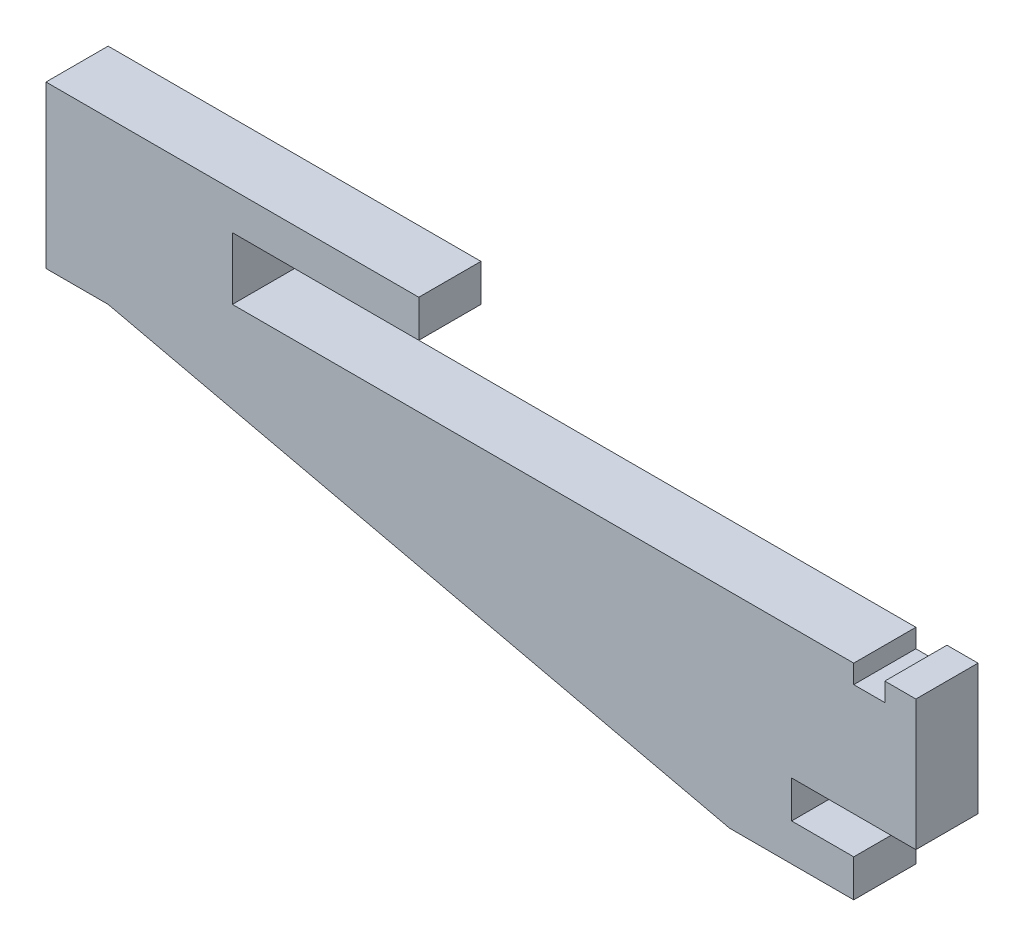
ISO-10303-21;
HEADER;
FILE_DESCRIPTION(('STEP AP214'),'2;1');
FILE_NAME('part.step','',(''),(''),'','','');
FILE_SCHEMA(('AUTOMOTIVE_DESIGN { 1 0 10303 214 1 1 1 1 }'));
ENDSEC;
DATA;
#1=APPLICATION_CONTEXT('core data for automotive mechanical design processes');
#2=APPLICATION_PROTOCOL_DEFINITION('international standard','automotive_design',2000,#1);
#3=PRODUCT_CONTEXT('',#1,'mechanical');
#4=PRODUCT('Part','Part','',(#3));
#5=PRODUCT_RELATED_PRODUCT_CATEGORY('part','',(#4));
#6=PRODUCT_DEFINITION_FORMATION('','',#4);
#7=PRODUCT_DEFINITION_CONTEXT('part definition',#1,'design');
#8=PRODUCT_DEFINITION('design','',#6,#7);
#9=PRODUCT_DEFINITION_SHAPE('','',#8);
#10=(LENGTH_UNIT() NAMED_UNIT(*) SI_UNIT(.MILLI.,.METRE.));
#11=(NAMED_UNIT(*) PLANE_ANGLE_UNIT() SI_UNIT($,.RADIAN.));
#12=(NAMED_UNIT(*) SI_UNIT($,.STERADIAN.) SOLID_ANGLE_UNIT());
#13=UNCERTAINTY_MEASURE_WITH_UNIT(LENGTH_MEASURE(1.E-05),#10,'distance_accuracy_value','');
#14=(GEOMETRIC_REPRESENTATION_CONTEXT(3) GLOBAL_UNCERTAINTY_ASSIGNED_CONTEXT((#13)) GLOBAL_UNIT_ASSIGNED_CONTEXT((#10,
#11,#12)) REPRESENTATION_CONTEXT('',''));
#15=CARTESIAN_POINT('',(0.,0.,0.));
#16=DIRECTION('',(0.,0.,1.));
#17=DIRECTION('',(1.,0.,0.));
#18=AXIS2_PLACEMENT_3D('',#15,#16,#17);
#19=CARTESIAN_POINT('',(0.,-139.5,-7.5));
#20=DIRECTION('',(0.,1.,0.));
#21=DIRECTION('',(0.,0.,1.));
#22=AXIS2_PLACEMENT_3D('',#19,#20,#21);
#23=PLANE('',#22);
#24=DIRECTION('',(0.,0.,-1.));
#25=VECTOR('',#24,1.);
#26=CARTESIAN_POINT('',(-5.00000000000003,-139.5,-2.5));
#27=LINE('',#26,#25);
#28=CARTESIAN_POINT('',(-5.00000000000003,-139.5,-2.5));
#29=VERTEX_POINT('',#28);
#30=CARTESIAN_POINT('',(-5.00000000000003,-139.5,-7.5));
#31=VERTEX_POINT('',#30);
#32=EDGE_CURVE('E293',#29,#31,#27,.T.);
#33=ORIENTED_EDGE('',*,*,#32,.T.);
#34=DIRECTION('',(-1.,0.,0.));
#35=VECTOR('',#34,1.);
#36=CARTESIAN_POINT('',(0.,-139.5,-7.5));
#37=LINE('',#36,#35);
#38=CARTESIAN_POINT('',(-55.,-139.5,-7.5));
#39=VERTEX_POINT('',#38);
#40=EDGE_CURVE('E307',#31,#39,#37,.T.);
#41=ORIENTED_EDGE('',*,*,#40,.T.);
#42=DIRECTION('',(0.,0.,1.));
#43=VECTOR('',#42,1.);
#44=CARTESIAN_POINT('',(-55.,-139.5,-7.5));
#45=LINE('',#44,#43);
#46=CARTESIAN_POINT('',(-55.,-139.5,-2.5));
#47=VERTEX_POINT('',#46);
#48=EDGE_CURVE('E229',#39,#47,#45,.T.);
#49=ORIENTED_EDGE('',*,*,#48,.T.);
#50=DIRECTION('',(-1.,0.,0.));
#51=VECTOR('',#50,1.);
#52=CARTESIAN_POINT('',(0.,-139.5,-2.5));
#53=LINE('',#52,#51);
#54=EDGE_CURVE('E203',#29,#47,#53,.T.);
#55=ORIENTED_EDGE('',*,*,#54,.F.);
#56=EDGE_LOOP('',(#33,#41,#49,#55));
#57=FACE_BOUND('',#56,.T.);
#58=ADVANCED_FACE('F33',(#57),#23,.T.);
#59=CARTESIAN_POINT('',(-65.,-144.5,-7.5));
#60=DIRECTION('',(-0.224147692921427,-0.9745551866149,0.));
#61=DIRECTION('',(0.9745551866149,-0.224147692921427,0.));
#62=AXIS2_PLACEMENT_3D('',#59,#60,#61);
#63=PLANE('',#62);
#64=DIRECTION('',(0.9745551866149,-0.224147692921427,0.));
#65=VECTOR('',#64,1.);
#66=CARTESIAN_POINT('',(-65.,-144.5,-2.5));
#67=LINE('',#66,#65);
#68=CARTESIAN_POINT('',(-65.,-144.5,-2.5));
#69=VERTEX_POINT('',#68);
#70=CARTESIAN_POINT('',(-15.,-156.,-2.5));
#71=VERTEX_POINT('',#70);
#72=EDGE_CURVE('E181',#69,#71,#67,.T.);
#73=ORIENTED_EDGE('',*,*,#72,.F.);
#74=DIRECTION('',(0.,0.,1.));
#75=VECTOR('',#74,1.);
#76=CARTESIAN_POINT('',(-65.,-144.5,-7.5));
#77=LINE('',#76,#75);
#78=CARTESIAN_POINT('',(-65.,-144.5,-7.5));
#79=VERTEX_POINT('',#78);
#80=EDGE_CURVE('E11',#79,#69,#77,.T.);
#81=ORIENTED_EDGE('',*,*,#80,.F.);
#82=DIRECTION('',(0.9745551866149,-0.224147692921427,0.));
#83=VECTOR('',#82,1.);
#84=CARTESIAN_POINT('',(-65.,-144.5,-7.5));
#85=LINE('',#84,#83);
#86=CARTESIAN_POINT('',(-15.,-156.,-7.5));
#87=VERTEX_POINT('',#86);
#88=EDGE_CURVE('E221',#79,#87,#85,.T.);
#89=ORIENTED_EDGE('',*,*,#88,.T.);
#90=DIRECTION('',(0.,0.,1.));
#91=VECTOR('',#90,1.);
#92=CARTESIAN_POINT('',(-15.,-156.,-7.5));
#93=LINE('',#92,#91);
#94=EDGE_CURVE('E37',#87,#71,#93,.T.);
#95=ORIENTED_EDGE('',*,*,#94,.T.);
#96=EDGE_LOOP('',(#73,#81,#89,#95));
#97=FACE_BOUND('',#96,.T.);
#98=ADVANCED_FACE('F35',(#97),#63,.T.);
#99=CARTESIAN_POINT('',(-70.,-144.5,-7.5));
#100=DIRECTION('',(0.,-1.,0.));
#101=DIRECTION('',(0.,0.,-1.));
#102=AXIS2_PLACEMENT_3D('',#99,#100,#101);
#103=PLANE('',#102);
#104=DIRECTION('',(1.,0.,0.));
#105=VECTOR('',#104,1.);
#106=CARTESIAN_POINT('',(-70.,-144.5,-2.5));
#107=LINE('',#106,#105);
#108=CARTESIAN_POINT('',(-70.,-144.5,-2.5));
#109=VERTEX_POINT('',#108);
#110=EDGE_CURVE('E219',#109,#69,#107,.T.);
#111=ORIENTED_EDGE('',*,*,#110,.F.);
#112=DIRECTION('',(0.,0.,1.));
#113=VECTOR('',#112,1.);
#114=CARTESIAN_POINT('',(-70.,-144.5,-7.5));
#115=LINE('',#114,#113);
#116=CARTESIAN_POINT('',(-70.,-144.5,-7.5));
#117=VERTEX_POINT('',#116);
#118=EDGE_CURVE('E42',#117,#109,#115,.T.);
#119=ORIENTED_EDGE('',*,*,#118,.F.);
#120=DIRECTION('',(1.,0.,0.));
#121=VECTOR('',#120,1.);
#122=CARTESIAN_POINT('',(-70.,-144.5,-7.5));
#123=LINE('',#122,#121);
#124=EDGE_CURVE('E171',#117,#79,#123,.T.);
#125=ORIENTED_EDGE('',*,*,#124,.T.);
#126=ORIENTED_EDGE('',*,*,#80,.T.);
#127=EDGE_LOOP('',(#111,#119,#125,#126));
#128=FACE_BOUND('',#127,.T.);
#129=ADVANCED_FACE('F247',(#128),#103,.T.);
#130=CARTESIAN_POINT('',(-70.,-139.5,-7.5));
#131=DIRECTION('',(-1.,0.,0.));
#132=DIRECTION('',(0.,0.,1.));
#133=AXIS2_PLACEMENT_3D('',#130,#131,#132);
#134=PLANE('',#133);
#135=DIRECTION('',(0.,-1.,0.));
#136=VECTOR('',#135,1.);
#137=CARTESIAN_POINT('',(-70.,-139.5,-2.5));
#138=LINE('',#137,#136);
#139=CARTESIAN_POINT('',(-70.,-131.5,-2.5));
#140=VERTEX_POINT('',#139);
#141=EDGE_CURVE('E156',#140,#109,#138,.T.);
#142=ORIENTED_EDGE('',*,*,#141,.F.);
#143=DIRECTION('',(0.,0.,1.));
#144=VECTOR('',#143,1.);
#145=CARTESIAN_POINT('',(-70.,-131.5,-7.5));
#146=LINE('',#145,#144);
#147=CARTESIAN_POINT('',(-70.,-131.5,-7.5));
#148=VERTEX_POINT('',#147);
#149=EDGE_CURVE('E150',#148,#140,#146,.T.);
#150=ORIENTED_EDGE('',*,*,#149,.F.);
#151=DIRECTION('',(0.,-1.,0.));
#152=VECTOR('',#151,1.);
#153=CARTESIAN_POINT('',(-70.,-139.5,-7.5));
#154=LINE('',#153,#152);
#155=EDGE_CURVE('E153',#148,#117,#154,.T.);
#156=ORIENTED_EDGE('',*,*,#155,.T.);
#157=ORIENTED_EDGE('',*,*,#118,.T.);
#158=EDGE_LOOP('',(#142,#150,#156,#157));
#159=FACE_BOUND('',#158,.T.);
#160=ADVANCED_FACE('F152',(#159),#134,.T.);
#161=CARTESIAN_POINT('',(-70.,-131.5,-7.5));
#162=DIRECTION('',(0.,1.,0.));
#163=DIRECTION('',(0.,0.,1.));
#164=AXIS2_PLACEMENT_3D('',#161,#162,#163);
#165=PLANE('',#164);
#166=DIRECTION('',(-1.,0.,0.));
#167=VECTOR('',#166,1.);
#168=CARTESIAN_POINT('',(-70.,-131.5,-2.5));
#169=LINE('',#168,#167);
#170=CARTESIAN_POINT('',(-40.,-131.5,-2.5));
#171=VERTEX_POINT('',#170);
#172=EDGE_CURVE('E216',#171,#140,#169,.T.);
#173=ORIENTED_EDGE('',*,*,#172,.F.);
#174=DIRECTION('',(0.,0.,1.));
#175=VECTOR('',#174,1.);
#176=CARTESIAN_POINT('',(-40.,-131.5,-7.5));
#177=LINE('',#176,#175);
#178=CARTESIAN_POINT('',(-40.,-131.5,-7.5));
#179=VERTEX_POINT('',#178);
#180=EDGE_CURVE('E161',#179,#171,#177,.T.);
#181=ORIENTED_EDGE('',*,*,#180,.F.);
#182=DIRECTION('',(-1.,0.,0.));
#183=VECTOR('',#182,1.);
#184=CARTESIAN_POINT('',(-70.,-131.5,-7.5));
#185=LINE('',#184,#183);
#186=EDGE_CURVE('E169',#179,#148,#185,.T.);
#187=ORIENTED_EDGE('',*,*,#186,.T.);
#188=ORIENTED_EDGE('',*,*,#149,.T.);
#189=EDGE_LOOP('',(#173,#181,#187,#188));
#190=FACE_BOUND('',#189,.T.);
#191=ADVANCED_FACE('F173',(#190),#165,.T.);
#192=CARTESIAN_POINT('',(-40.,-131.5,-7.5));
#193=DIRECTION('',(1.,0.,0.));
#194=DIRECTION('',(0.,0.,-1.));
#195=AXIS2_PLACEMENT_3D('',#192,#193,#194);
#196=PLANE('',#195);
#197=DIRECTION('',(0.,1.,0.));
#198=VECTOR('',#197,1.);
#199=CARTESIAN_POINT('',(-40.,-131.5,-2.5));
#200=LINE('',#199,#198);
#201=CARTESIAN_POINT('',(-40.,-134.5,-2.5));
#202=VERTEX_POINT('',#201);
#203=EDGE_CURVE('E213',#202,#171,#200,.T.);
#204=ORIENTED_EDGE('',*,*,#203,.F.);
#205=DIRECTION('',(0.,0.,1.));
#206=VECTOR('',#205,1.);
#207=CARTESIAN_POINT('',(-40.,-134.5,-7.5));
#208=LINE('',#207,#206);
#209=CARTESIAN_POINT('',(-40.,-134.5,-7.5));
#210=VERTEX_POINT('',#209);
#211=EDGE_CURVE('E225',#210,#202,#208,.T.);
#212=ORIENTED_EDGE('',*,*,#211,.F.);
#213=DIRECTION('',(0.,1.,0.));
#214=VECTOR('',#213,1.);
#215=CARTESIAN_POINT('',(-40.,-131.5,-7.5));
#216=LINE('',#215,#214);
#217=EDGE_CURVE('E174',#210,#179,#216,.T.);
#218=ORIENTED_EDGE('',*,*,#217,.T.);
#219=ORIENTED_EDGE('',*,*,#180,.T.);
#220=EDGE_LOOP('',(#204,#212,#218,#219));
#221=FACE_BOUND('',#220,.T.);
#222=ADVANCED_FACE('F478',(#221),#196,.T.);
#223=CARTESIAN_POINT('',(-40.,-134.5,-7.5));
#224=DIRECTION('',(0.,-1.,0.));
#225=DIRECTION('',(0.,0.,-1.));
#226=AXIS2_PLACEMENT_3D('',#223,#224,#225);
#227=PLANE('',#226);
#228=DIRECTION('',(1.,0.,0.));
#229=VECTOR('',#228,1.);
#230=CARTESIAN_POINT('',(-40.,-134.5,-2.5));
#231=LINE('',#230,#229);
#232=CARTESIAN_POINT('',(-55.,-134.5,-2.5));
#233=VERTEX_POINT('',#232);
#234=EDGE_CURVE('E210',#233,#202,#231,.T.);
#235=ORIENTED_EDGE('',*,*,#234,.F.);
#236=DIRECTION('',(0.,0.,1.));
#237=VECTOR('',#236,1.);
#238=CARTESIAN_POINT('',(-55.,-134.5,-7.5));
#239=LINE('',#238,#237);
#240=CARTESIAN_POINT('',(-55.,-134.5,-7.5));
#241=VERTEX_POINT('',#240);
#242=EDGE_CURVE('E227',#241,#233,#239,.T.);
#243=ORIENTED_EDGE('',*,*,#242,.F.);
#244=DIRECTION('',(1.,0.,0.));
#245=VECTOR('',#244,1.);
#246=CARTESIAN_POINT('',(-40.,-134.5,-7.5));
#247=LINE('',#246,#245);
#248=EDGE_CURVE('E176',#241,#210,#247,.T.);
#249=ORIENTED_EDGE('',*,*,#248,.T.);
#250=ORIENTED_EDGE('',*,*,#211,.T.);
#251=EDGE_LOOP('',(#235,#243,#249,#250));
#252=FACE_BOUND('',#251,.T.);
#253=ADVANCED_FACE('F275',(#252),#227,.T.);
#254=CARTESIAN_POINT('',(-55.,-134.5,-7.5));
#255=DIRECTION('',(1.,0.,0.));
#256=DIRECTION('',(0.,0.,-1.));
#257=AXIS2_PLACEMENT_3D('',#254,#255,#256);
#258=PLANE('',#257);
#259=DIRECTION('',(0.,1.,0.));
#260=VECTOR('',#259,1.);
#261=CARTESIAN_POINT('',(-55.,-134.5,-2.5));
#262=LINE('',#261,#260);
#263=EDGE_CURVE('E207',#47,#233,#262,.T.);
#264=ORIENTED_EDGE('',*,*,#263,.F.);
#265=ORIENTED_EDGE('',*,*,#48,.F.);
#266=DIRECTION('',(0.,1.,0.));
#267=VECTOR('',#266,1.);
#268=CARTESIAN_POINT('',(-55.,-134.5,-7.5));
#269=LINE('',#268,#267);
#270=EDGE_CURVE('E306',#39,#241,#269,.T.);
#271=ORIENTED_EDGE('',*,*,#270,.T.);
#272=ORIENTED_EDGE('',*,*,#242,.T.);
#273=EDGE_LOOP('',(#264,#265,#271,#272));
#274=FACE_BOUND('',#273,.T.);
#275=ADVANCED_FACE('F267',(#274),#258,.T.);
#276=DIRECTION('',(0.,0.,-1.));
#277=VECTOR('',#276,1.);
#278=CARTESIAN_POINT('',(-2.50000000000003,-139.5,-2.5));
#279=LINE('',#278,#277);
#280=CARTESIAN_POINT('',(-2.50000000000003,-139.5,-2.5));
#281=VERTEX_POINT('',#280);
#282=CARTESIAN_POINT('',(-2.50000000000003,-139.5,-7.5));
#283=VERTEX_POINT('',#282);
#284=EDGE_CURVE('E282',#281,#283,#279,.T.);
#285=ORIENTED_EDGE('',*,*,#284,.F.);
#286=CARTESIAN_POINT('',(0.,-139.5,-2.5));
#287=VERTEX_POINT('',#286);
#288=EDGE_CURVE('E204',#287,#281,#53,.T.);
#289=ORIENTED_EDGE('',*,*,#288,.F.);
#290=DIRECTION('',(0.,0.,1.));
#291=VECTOR('',#290,1.);
#292=CARTESIAN_POINT('',(0.,-139.5,-7.5));
#293=LINE('',#292,#291);
#294=CARTESIAN_POINT('',(0.,-139.5,-7.5));
#295=VERTEX_POINT('',#294);
#296=EDGE_CURVE('E232',#295,#287,#293,.T.);
#297=ORIENTED_EDGE('',*,*,#296,.F.);
#298=EDGE_CURVE('E285',#295,#283,#37,.T.);
#299=ORIENTED_EDGE('',*,*,#298,.T.);
#300=EDGE_LOOP('',(#285,#289,#297,#299));
#301=FACE_BOUND('',#300,.T.);
#302=ADVANCED_FACE('F259',(#301),#23,.T.);
#303=CARTESIAN_POINT('',(0.,-150.,-7.5));
#304=DIRECTION('',(1.,0.,0.));
#305=DIRECTION('',(0.,1.,0.));
#306=AXIS2_PLACEMENT_3D('',#303,#304,#305);
#307=PLANE('',#306);
#308=DIRECTION('',(0.,1.,0.));
#309=VECTOR('',#308,1.);
#310=CARTESIAN_POINT('',(0.,-150.,-2.5));
#311=LINE('',#310,#309);
#312=CARTESIAN_POINT('',(0.,-150.,-2.5));
#313=VERTEX_POINT('',#312);
#314=EDGE_CURVE('E200',#313,#287,#311,.T.);
#315=ORIENTED_EDGE('',*,*,#314,.F.);
#316=DIRECTION('',(0.,0.,1.));
#317=VECTOR('',#316,1.);
#318=CARTESIAN_POINT('',(0.,-150.,-7.5));
#319=LINE('',#318,#317);
#320=CARTESIAN_POINT('',(0.,-150.,-7.5));
#321=VERTEX_POINT('',#320);
#322=EDGE_CURVE('E234',#321,#313,#319,.T.);
#323=ORIENTED_EDGE('',*,*,#322,.F.);
#324=DIRECTION('',(0.,1.,0.));
#325=VECTOR('',#324,1.);
#326=CARTESIAN_POINT('',(0.,-150.,-7.5));
#327=LINE('',#326,#325);
#328=EDGE_CURVE('E301',#321,#295,#327,.T.);
#329=ORIENTED_EDGE('',*,*,#328,.T.);
#330=ORIENTED_EDGE('',*,*,#296,.T.);
#331=EDGE_LOOP('',(#315,#323,#329,#330));
#332=FACE_BOUND('',#331,.T.);
#333=ADVANCED_FACE('F266',(#332),#307,.T.);
#334=CARTESIAN_POINT('',(-10.,-150.,-7.5));
#335=DIRECTION('',(0.,-1.,0.));
#336=DIRECTION('',(0.,0.,-1.));
#337=AXIS2_PLACEMENT_3D('',#334,#335,#336);
#338=PLANE('',#337);
#339=DIRECTION('',(1.,0.,0.));
#340=VECTOR('',#339,1.);
#341=CARTESIAN_POINT('',(-10.,-150.,-2.5));
#342=LINE('',#341,#340);
#343=CARTESIAN_POINT('',(-10.,-150.,-2.5));
#344=VERTEX_POINT('',#343);
#345=EDGE_CURVE('E197',#344,#313,#342,.T.);
#346=ORIENTED_EDGE('',*,*,#345,.F.);
#347=DIRECTION('',(0.,0.,1.));
#348=VECTOR('',#347,1.);
#349=CARTESIAN_POINT('',(-10.,-150.,-7.5));
#350=LINE('',#349,#348);
#351=CARTESIAN_POINT('',(-10.,-150.,-7.5));
#352=VERTEX_POINT('',#351);
#353=EDGE_CURVE('E236',#352,#344,#350,.T.);
#354=ORIENTED_EDGE('',*,*,#353,.F.);
#355=DIRECTION('',(1.,0.,0.));
#356=VECTOR('',#355,1.);
#357=CARTESIAN_POINT('',(-10.,-150.,-7.5));
#358=LINE('',#357,#356);
#359=EDGE_CURVE('E360',#352,#321,#358,.T.);
#360=ORIENTED_EDGE('',*,*,#359,.T.);
#361=ORIENTED_EDGE('',*,*,#322,.T.);
#362=EDGE_LOOP('',(#346,#354,#360,#361));
#363=FACE_BOUND('',#362,.T.);
#364=ADVANCED_FACE('F273',(#363),#338,.T.);
#365=CARTESIAN_POINT('',(-10.,-153.,-7.5));
#366=DIRECTION('',(1.,0.,0.));
#367=DIRECTION('',(0.,0.,-1.));
#368=AXIS2_PLACEMENT_3D('',#365,#366,#367);
#369=PLANE('',#368);
#370=DIRECTION('',(0.,1.,0.));
#371=VECTOR('',#370,1.);
#372=CARTESIAN_POINT('',(-10.,-153.,-2.5));
#373=LINE('',#372,#371);
#374=CARTESIAN_POINT('',(-10.,-153.,-2.5));
#375=VERTEX_POINT('',#374);
#376=EDGE_CURVE('E194',#375,#344,#373,.T.);
#377=ORIENTED_EDGE('',*,*,#376,.F.);
#378=DIRECTION('',(0.,0.,1.));
#379=VECTOR('',#378,1.);
#380=CARTESIAN_POINT('',(-10.,-153.,-7.5));
#381=LINE('',#380,#379);
#382=CARTESIAN_POINT('',(-10.,-153.,-7.5));
#383=VERTEX_POINT('',#382);
#384=EDGE_CURVE('E238',#383,#375,#381,.T.);
#385=ORIENTED_EDGE('',*,*,#384,.F.);
#386=DIRECTION('',(0.,1.,0.));
#387=VECTOR('',#386,1.);
#388=CARTESIAN_POINT('',(-10.,-153.,-7.5));
#389=LINE('',#388,#387);
#390=EDGE_CURVE('E358',#383,#352,#389,.T.);
#391=ORIENTED_EDGE('',*,*,#390,.T.);
#392=ORIENTED_EDGE('',*,*,#353,.T.);
#393=EDGE_LOOP('',(#377,#385,#391,#392));
#394=FACE_BOUND('',#393,.T.);
#395=ADVANCED_FACE('F366',(#394),#369,.T.);
#396=CARTESIAN_POINT('',(-5.,-153.,-7.5));
#397=DIRECTION('',(0.,1.,0.));
#398=DIRECTION('',(0.,0.,1.));
#399=AXIS2_PLACEMENT_3D('',#396,#397,#398);
#400=PLANE('',#399);
#401=DIRECTION('',(-1.,0.,0.));
#402=VECTOR('',#401,1.);
#403=CARTESIAN_POINT('',(-5.,-153.,-2.5));
#404=LINE('',#403,#402);
#405=CARTESIAN_POINT('',(-5.,-153.,-2.5));
#406=VERTEX_POINT('',#405);
#407=EDGE_CURVE('E191',#406,#375,#404,.T.);
#408=ORIENTED_EDGE('',*,*,#407,.F.);
#409=DIRECTION('',(0.,0.,1.));
#410=VECTOR('',#409,1.);
#411=CARTESIAN_POINT('',(-5.,-153.,-7.5));
#412=LINE('',#411,#410);
#413=CARTESIAN_POINT('',(-5.,-153.,-7.5));
#414=VERTEX_POINT('',#413);
#415=EDGE_CURVE('E240',#414,#406,#412,.T.);
#416=ORIENTED_EDGE('',*,*,#415,.F.);
#417=DIRECTION('',(-1.,0.,0.));
#418=VECTOR('',#417,1.);
#419=CARTESIAN_POINT('',(-5.,-153.,-7.5));
#420=LINE('',#419,#418);
#421=EDGE_CURVE('E355',#414,#383,#420,.T.);
#422=ORIENTED_EDGE('',*,*,#421,.T.);
#423=ORIENTED_EDGE('',*,*,#384,.T.);
#424=EDGE_LOOP('',(#408,#416,#422,#423));
#425=FACE_BOUND('',#424,.T.);
#426=ADVANCED_FACE('F369',(#425),#400,.T.);
#427=CARTESIAN_POINT('',(-5.,-156.,-7.5));
#428=DIRECTION('',(1.,0.,0.));
#429=DIRECTION('',(0.,1.,0.));
#430=AXIS2_PLACEMENT_3D('',#427,#428,#429);
#431=PLANE('',#430);
#432=DIRECTION('',(0.,1.,0.));
#433=VECTOR('',#432,1.);
#434=CARTESIAN_POINT('',(-5.,-156.,-2.5));
#435=LINE('',#434,#433);
#436=CARTESIAN_POINT('',(-5.,-156.,-2.5));
#437=VERTEX_POINT('',#436);
#438=EDGE_CURVE('E188',#437,#406,#435,.T.);
#439=ORIENTED_EDGE('',*,*,#438,.F.);
#440=DIRECTION('',(0.,0.,1.));
#441=VECTOR('',#440,1.);
#442=CARTESIAN_POINT('',(-5.,-156.,-7.5));
#443=LINE('',#442,#441);
#444=CARTESIAN_POINT('',(-5.,-156.,-7.5));
#445=VERTEX_POINT('',#444);
#446=EDGE_CURVE('E241',#445,#437,#443,.T.);
#447=ORIENTED_EDGE('',*,*,#446,.F.);
#448=DIRECTION('',(0.,1.,0.));
#449=VECTOR('',#448,1.);
#450=CARTESIAN_POINT('',(-5.,-156.,-7.5));
#451=LINE('',#450,#449);
#452=EDGE_CURVE('E352',#445,#414,#451,.T.);
#453=ORIENTED_EDGE('',*,*,#452,.T.);
#454=ORIENTED_EDGE('',*,*,#415,.T.);
#455=EDGE_LOOP('',(#439,#447,#453,#454));
#456=FACE_BOUND('',#455,.T.);
#457=ADVANCED_FACE('F372',(#456),#431,.T.);
#458=CARTESIAN_POINT('',(-15.,-156.,-7.5));
#459=DIRECTION('',(0.,-1.,0.));
#460=DIRECTION('',(0.,0.,-1.));
#461=AXIS2_PLACEMENT_3D('',#458,#459,#460);
#462=PLANE('',#461);
#463=DIRECTION('',(1.,0.,0.));
#464=VECTOR('',#463,1.);
#465=CARTESIAN_POINT('',(-15.,-156.,-2.5));
#466=LINE('',#465,#464);
#467=EDGE_CURVE('E184',#71,#437,#466,.T.);
#468=ORIENTED_EDGE('',*,*,#467,.F.);
#469=ORIENTED_EDGE('',*,*,#94,.F.);
#470=DIRECTION('',(1.,0.,0.));
#471=VECTOR('',#470,1.);
#472=CARTESIAN_POINT('',(-15.,-156.,-7.5));
#473=LINE('',#472,#471);
#474=EDGE_CURVE('E350',#87,#445,#473,.T.);
#475=ORIENTED_EDGE('',*,*,#474,.T.);
#476=ORIENTED_EDGE('',*,*,#446,.T.);
#477=EDGE_LOOP('',(#468,#469,#475,#476));
#478=FACE_BOUND('',#477,.T.);
#479=ADVANCED_FACE('F243',(#478),#462,.T.);
#480=CARTESIAN_POINT('',(0.,0.,-7.5));
#481=DIRECTION('',(0.,0.,1.));
#482=DIRECTION('',(1.,0.,0.));
#483=AXIS2_PLACEMENT_3D('',#480,#481,#482);
#484=PLANE('',#483);
#485=ORIENTED_EDGE('',*,*,#40,.F.);
#486=DIRECTION('',(0.,1.,0.));
#487=VECTOR('',#486,1.);
#488=CARTESIAN_POINT('',(-5.00000000000003,-141.,-7.5));
#489=LINE('',#488,#487);
#490=CARTESIAN_POINT('',(-5.00000000000003,-141.,-7.5));
#491=VERTEX_POINT('',#490);
#492=EDGE_CURVE('E326',#491,#31,#489,.T.);
#493=ORIENTED_EDGE('',*,*,#492,.F.);
#494=DIRECTION('',(-1.,0.,0.));
#495=VECTOR('',#494,1.);
#496=CARTESIAN_POINT('',(-2.50000000000003,-141.,-7.5));
#497=LINE('',#496,#495);
#498=CARTESIAN_POINT('',(-2.50000000000003,-141.,-7.5));
#499=VERTEX_POINT('',#498);
#500=EDGE_CURVE('E339',#499,#491,#497,.T.);
#501=ORIENTED_EDGE('',*,*,#500,.F.);
#502=DIRECTION('',(0.,-1.,0.));
#503=VECTOR('',#502,1.);
#504=CARTESIAN_POINT('',(-2.50000000000003,-139.5,-7.5));
#505=LINE('',#504,#503);
#506=EDGE_CURVE('E305',#283,#499,#505,.T.);
#507=ORIENTED_EDGE('',*,*,#506,.F.);
#508=ORIENTED_EDGE('',*,*,#298,.F.);
#509=ORIENTED_EDGE('',*,*,#328,.F.);
#510=ORIENTED_EDGE('',*,*,#359,.F.);
#511=ORIENTED_EDGE('',*,*,#390,.F.);
#512=ORIENTED_EDGE('',*,*,#421,.F.);
#513=ORIENTED_EDGE('',*,*,#452,.F.);
#514=ORIENTED_EDGE('',*,*,#474,.F.);
#515=ORIENTED_EDGE('',*,*,#88,.F.);
#516=ORIENTED_EDGE('',*,*,#124,.F.);
#517=ORIENTED_EDGE('',*,*,#155,.F.);
#518=ORIENTED_EDGE('',*,*,#186,.F.);
#519=ORIENTED_EDGE('',*,*,#217,.F.);
#520=ORIENTED_EDGE('',*,*,#248,.F.);
#521=ORIENTED_EDGE('',*,*,#270,.F.);
#522=EDGE_LOOP('',(#485,#493,#501,#507,#508,#509,#510,#511,#512,#513,#514,#515,#516,#517,#518,
#519,#520,#521));
#523=FACE_BOUND('',#522,.T.);
#524=ADVANCED_FACE('F167',(#523),#484,.F.);
#525=CARTESIAN_POINT('',(0.,0.,-2.5));
#526=DIRECTION('',(0.,0.,1.));
#527=DIRECTION('',(1.,0.,0.));
#528=AXIS2_PLACEMENT_3D('',#525,#526,#527);
#529=PLANE('',#528);
#530=DIRECTION('',(0.,1.,0.));
#531=VECTOR('',#530,1.);
#532=CARTESIAN_POINT('',(-5.00000000000003,-141.,-2.5));
#533=LINE('',#532,#531);
#534=CARTESIAN_POINT('',(-5.00000000000003,-141.,-2.5));
#535=VERTEX_POINT('',#534);
#536=EDGE_CURVE('E337',#535,#29,#533,.T.);
#537=ORIENTED_EDGE('',*,*,#536,.T.);
#538=ORIENTED_EDGE('',*,*,#54,.T.);
#539=ORIENTED_EDGE('',*,*,#263,.T.);
#540=ORIENTED_EDGE('',*,*,#234,.T.);
#541=ORIENTED_EDGE('',*,*,#203,.T.);
#542=ORIENTED_EDGE('',*,*,#172,.T.);
#543=ORIENTED_EDGE('',*,*,#141,.T.);
#544=ORIENTED_EDGE('',*,*,#110,.T.);
#545=ORIENTED_EDGE('',*,*,#72,.T.);
#546=ORIENTED_EDGE('',*,*,#467,.T.);
#547=ORIENTED_EDGE('',*,*,#438,.T.);
#548=ORIENTED_EDGE('',*,*,#407,.T.);
#549=ORIENTED_EDGE('',*,*,#376,.T.);
#550=ORIENTED_EDGE('',*,*,#345,.T.);
#551=ORIENTED_EDGE('',*,*,#314,.T.);
#552=ORIENTED_EDGE('',*,*,#288,.T.);
#553=DIRECTION('',(0.,-1.,0.));
#554=VECTOR('',#553,1.);
#555=CARTESIAN_POINT('',(-2.50000000000003,-139.5,-2.5));
#556=LINE('',#555,#554);
#557=CARTESIAN_POINT('',(-2.50000000000003,-141.,-2.5));
#558=VERTEX_POINT('',#557);
#559=EDGE_CURVE('E296',#281,#558,#556,.T.);
#560=ORIENTED_EDGE('',*,*,#559,.T.);
#561=DIRECTION('',(-1.,0.,0.));
#562=VECTOR('',#561,1.);
#563=CARTESIAN_POINT('',(-2.50000000000003,-141.,-2.5));
#564=LINE('',#563,#562);
#565=EDGE_CURVE('E50',#558,#535,#564,.T.);
#566=ORIENTED_EDGE('',*,*,#565,.T.);
#567=EDGE_LOOP('',(#537,#538,#539,#540,#541,#542,#543,#544,#545,#546,#547,#548,#549,#550,#551,
#552,#560,#566));
#568=FACE_BOUND('',#567,.T.);
#569=ADVANCED_FACE('F246',(#568),#529,.T.);
#570=CARTESIAN_POINT('',(-5.00000000000003,-141.,-2.5));
#571=DIRECTION('',(-1.,0.,0.));
#572=DIRECTION('',(0.,0.,1.));
#573=AXIS2_PLACEMENT_3D('',#570,#571,#572);
#574=PLANE('',#573);
#575=ORIENTED_EDGE('',*,*,#492,.T.);
#576=ORIENTED_EDGE('',*,*,#32,.F.);
#577=ORIENTED_EDGE('',*,*,#536,.F.);
#578=DIRECTION('',(0.,0.,-1.));
#579=VECTOR('',#578,1.);
#580=CARTESIAN_POINT('',(-5.00000000000003,-141.,-2.5));
#581=LINE('',#580,#579);
#582=EDGE_CURVE('E185',#535,#491,#581,.T.);
#583=ORIENTED_EDGE('',*,*,#582,.T.);
#584=EDGE_LOOP('',(#575,#576,#577,#583));
#585=FACE_BOUND('',#584,.T.);
#586=ADVANCED_FACE('F336',(#585),#574,.F.);
#587=CARTESIAN_POINT('',(-2.50000000000003,-141.,-2.5));
#588=DIRECTION('',(0.,-1.,0.));
#589=DIRECTION('',(0.,0.,-1.));
#590=AXIS2_PLACEMENT_3D('',#587,#588,#589);
#591=PLANE('',#590);
#592=ORIENTED_EDGE('',*,*,#500,.T.);
#593=ORIENTED_EDGE('',*,*,#582,.F.);
#594=ORIENTED_EDGE('',*,*,#565,.F.);
#595=DIRECTION('',(0.,0.,-1.));
#596=VECTOR('',#595,1.);
#597=CARTESIAN_POINT('',(-2.50000000000003,-141.,-2.5));
#598=LINE('',#597,#596);
#599=EDGE_CURVE('E292',#558,#499,#598,.T.);
#600=ORIENTED_EDGE('',*,*,#599,.T.);
#601=EDGE_LOOP('',(#592,#593,#594,#600));
#602=FACE_BOUND('',#601,.T.);
#603=ADVANCED_FACE('F440',(#602),#591,.F.);
#604=CARTESIAN_POINT('',(-2.50000000000003,-139.5,-2.5));
#605=DIRECTION('',(1.,0.,0.));
#606=DIRECTION('',(0.,0.,-1.));
#607=AXIS2_PLACEMENT_3D('',#604,#605,#606);
#608=PLANE('',#607);
#609=ORIENTED_EDGE('',*,*,#506,.T.);
#610=ORIENTED_EDGE('',*,*,#599,.F.);
#611=ORIENTED_EDGE('',*,*,#559,.F.);
#612=ORIENTED_EDGE('',*,*,#284,.T.);
#613=EDGE_LOOP('',(#609,#610,#611,#612));
#614=FACE_BOUND('',#613,.T.);
#615=ADVANCED_FACE('F449',(#614),#608,.F.);
#616=CLOSED_SHELL('',(#58,#98,#129,#160,#191,#222,#253,#275,#302,#333,#364,#395,#426,#457,#479,
#524,#569,#586,#603,#615));
#617=MANIFOLD_SOLID_BREP('B2',#616);
#618=ADVANCED_BREP_SHAPE_REPRESENTATION('',(#18,#617),#14);
#619=SHAPE_DEFINITION_REPRESENTATION(#9,#618);
ENDSEC;
END-ISO-10303-21;
